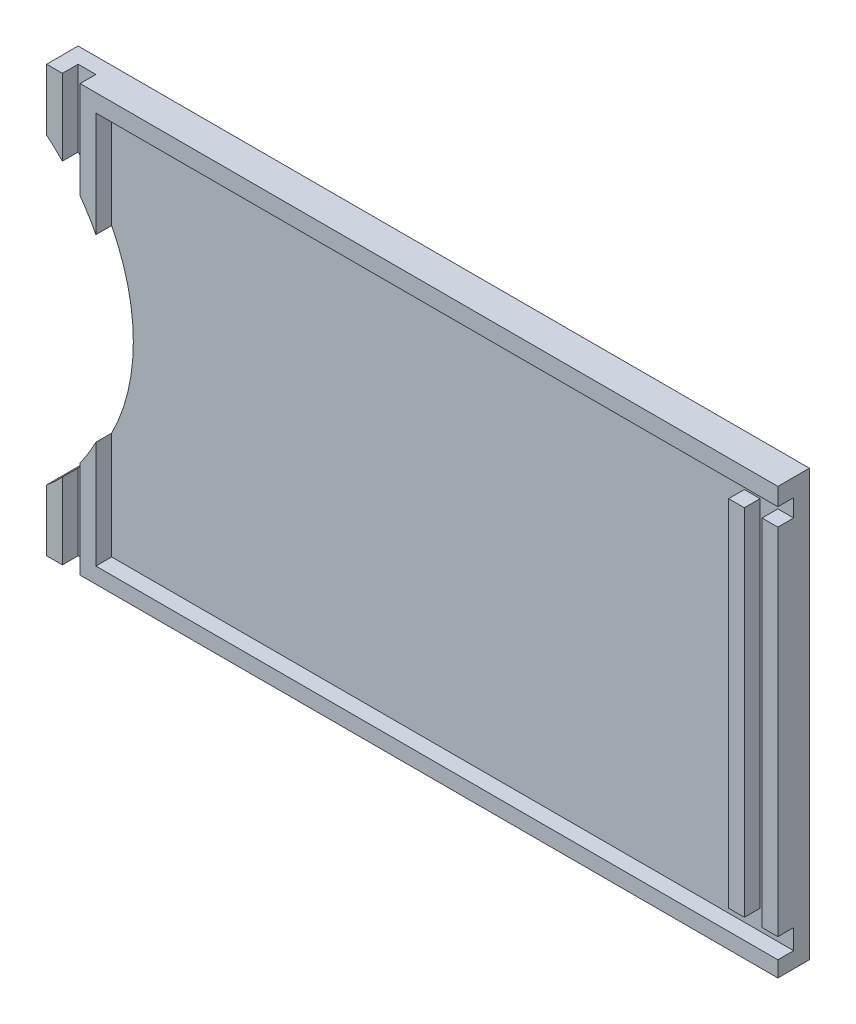
ISO-10303-21;
HEADER;
FILE_DESCRIPTION(('STEP AP214'),'2;1');
FILE_NAME('part.step','',(''),(''),'','','');
FILE_SCHEMA(('AUTOMOTIVE_DESIGN { 1 0 10303 214 1 1 1 1 }'));
ENDSEC;
DATA;
#1=APPLICATION_CONTEXT('core data for automotive mechanical design processes');
#2=APPLICATION_PROTOCOL_DEFINITION('international standard','automotive_design',2000,#1);
#3=PRODUCT_CONTEXT('',#1,'mechanical');
#4=PRODUCT('Part','Part','',(#3));
#5=PRODUCT_RELATED_PRODUCT_CATEGORY('part','',(#4));
#6=PRODUCT_DEFINITION_FORMATION('','',#4);
#7=PRODUCT_DEFINITION_CONTEXT('part definition',#1,'design');
#8=PRODUCT_DEFINITION('design','',#6,#7);
#9=PRODUCT_DEFINITION_SHAPE('','',#8);
#10=(LENGTH_UNIT() NAMED_UNIT(*) SI_UNIT(.MILLI.,.METRE.));
#11=(NAMED_UNIT(*) PLANE_ANGLE_UNIT() SI_UNIT($,.RADIAN.));
#12=(NAMED_UNIT(*) SI_UNIT($,.STERADIAN.) SOLID_ANGLE_UNIT());
#13=UNCERTAINTY_MEASURE_WITH_UNIT(LENGTH_MEASURE(1.E-05),#10,'distance_accuracy_value','');
#14=(GEOMETRIC_REPRESENTATION_CONTEXT(3) GLOBAL_UNCERTAINTY_ASSIGNED_CONTEXT((#13)) GLOBAL_UNIT_ASSIGNED_CONTEXT((#10,
#11,#12)) REPRESENTATION_CONTEXT('',''));
#15=CARTESIAN_POINT('',(0.,0.,0.));
#16=DIRECTION('',(0.,0.,1.));
#17=DIRECTION('',(1.,0.,0.));
#18=AXIS2_PLACEMENT_3D('',#15,#16,#17);
#19=CARTESIAN_POINT('',(118.091107297523,54.,-16.4879937354561));
#20=DIRECTION('',(0.,0.,-1.));
#21=DIRECTION('',(-1.,0.,0.));
#22=AXIS2_PLACEMENT_3D('',#19,#20,#21);
#23=PLANE('',#22);
#24=DIRECTION('',(-1.,0.,0.));
#25=VECTOR('',#24,1.);
#26=CARTESIAN_POINT('',(122.091107297523,-44.9153201748925,-16.4879937354561));
#27=LINE('',#26,#25);
#28=CARTESIAN_POINT('',(113.591107297523,-44.9153201748925,-16.4879937354561));
#29=VERTEX_POINT('',#28);
#30=CARTESIAN_POINT('',(109.591107297523,-44.9153201748925,-16.4879937354561));
#31=VERTEX_POINT('',#30);
#32=EDGE_CURVE('E383',#29,#31,#27,.T.);
#33=ORIENTED_EDGE('',*,*,#32,.T.);
#34=DIRECTION('',(0.,-1.,0.));
#35=VECTOR('',#34,1.);
#36=CARTESIAN_POINT('',(109.591107297523,54.,-16.4879937354561));
#37=LINE('',#36,#35);
#38=CARTESIAN_POINT('',(109.591107297523,45.0585432346725,-16.4879937354561));
#39=VERTEX_POINT('',#38);
#40=EDGE_CURVE('E342',#39,#31,#37,.T.);
#41=ORIENTED_EDGE('',*,*,#40,.F.);
#42=DIRECTION('',(1.,0.,0.));
#43=VECTOR('',#42,1.);
#44=CARTESIAN_POINT('',(122.091107297523,45.0585432346725,-16.4879937354561));
#45=LINE('',#44,#43);
#46=CARTESIAN_POINT('',(113.591107297523,45.0585432346725,-16.4879937354561));
#47=VERTEX_POINT('',#46);
#48=EDGE_CURVE('E408',#39,#47,#45,.T.);
#49=ORIENTED_EDGE('',*,*,#48,.T.);
#50=DIRECTION('',(0.,-1.,0.));
#51=VECTOR('',#50,1.);
#52=CARTESIAN_POINT('',(113.591107297523,54.,-16.4879937354561));
#53=LINE('',#52,#51);
#54=EDGE_CURVE('E334',#47,#29,#53,.T.);
#55=ORIENTED_EDGE('',*,*,#54,.T.);
#56=EDGE_LOOP('',(#33,#41,#49,#55));
#57=FACE_BOUND('',#56,.T.);
#58=DIRECTION('',(1.,0.,0.));
#59=VECTOR('',#58,1.);
#60=CARTESIAN_POINT('',(-50.9088927024772,49.5292716173362,-16.4879937354561));
#61=LINE('',#60,#59);
#62=CARTESIAN_POINT('',(-50.9088927024772,49.5292716173362,-16.4879937354561));
#63=VERTEX_POINT('',#62);
#64=CARTESIAN_POINT('',(122.091107297523,49.5292716173362,-16.4879937354561));
#65=VERTEX_POINT('',#64);
#66=EDGE_CURVE('E232',#63,#65,#61,.T.);
#67=ORIENTED_EDGE('',*,*,#66,.F.);
#68=DIRECTION('',(0.,-1.,0.));
#69=VECTOR('',#68,1.);
#70=CARTESIAN_POINT('',(-50.9088927024772,54.,-16.4879937354561));
#71=LINE('',#70,#69);
#72=CARTESIAN_POINT('',(-50.9088927024772,22.798026230356,-16.4879937354561));
#73=VERTEX_POINT('',#72);
#74=EDGE_CURVE('E240',#63,#73,#71,.T.);
#75=ORIENTED_EDGE('',*,*,#74,.T.);
#76=CARTESIAN_POINT('',(-95.4088927024772,0.,-16.4879937354561));
#77=DIRECTION('',(0.,0.,-1.));
#78=DIRECTION('',(-1.,0.,0.));
#79=AXIS2_PLACEMENT_3D('',#76,#77,#78);
#80=CIRCLE('',#79,50.);
#81=CARTESIAN_POINT('',(-50.9088927024772,-22.798026230356,-16.4879937354561));
#82=VERTEX_POINT('',#81);
#83=EDGE_CURVE('E352',#73,#82,#80,.T.);
#84=ORIENTED_EDGE('',*,*,#83,.T.);
#85=CARTESIAN_POINT('',(-50.9088927024772,-50.,-16.4879937354561));
#86=VERTEX_POINT('',#85);
#87=EDGE_CURVE('E344',#82,#86,#71,.T.);
#88=ORIENTED_EDGE('',*,*,#87,.T.);
#89=DIRECTION('',(-1.,0.,0.));
#90=VECTOR('',#89,1.);
#91=CARTESIAN_POINT('',(-50.9088927024772,-50.,-16.4879937354561));
#92=LINE('',#91,#90);
#93=CARTESIAN_POINT('',(122.091107297523,-50.,-16.4879937354561));
#94=VERTEX_POINT('',#93);
#95=EDGE_CURVE('E241',#94,#86,#92,.T.);
#96=ORIENTED_EDGE('',*,*,#95,.F.);
#97=DIRECTION('',(0.,1.,0.));
#98=VECTOR('',#97,1.);
#99=CARTESIAN_POINT('',(122.091107297523,-54.,-16.4879937354561));
#100=LINE('',#99,#98);
#101=CARTESIAN_POINT('',(122.091107297523,-44.9153201748925,-16.4879937354561));
#102=VERTEX_POINT('',#101);
#103=EDGE_CURVE('E387',#94,#102,#100,.T.);
#104=ORIENTED_EDGE('',*,*,#103,.T.);
#105=CARTESIAN_POINT('',(118.091107297523,-44.9153201748925,-16.4879937354561));
#106=VERTEX_POINT('',#105);
#107=EDGE_CURVE('E384',#102,#106,#27,.T.);
#108=ORIENTED_EDGE('',*,*,#107,.T.);
#109=DIRECTION('',(0.,-1.,0.));
#110=VECTOR('',#109,1.);
#111=CARTESIAN_POINT('',(118.091107297523,54.,-16.4879937354561));
#112=LINE('',#111,#110);
#113=CARTESIAN_POINT('',(118.091107297523,45.0585432346725,-16.4879937354561));
#114=VERTEX_POINT('',#113);
#115=EDGE_CURVE('E331',#114,#106,#112,.T.);
#116=ORIENTED_EDGE('',*,*,#115,.F.);
#117=CARTESIAN_POINT('',(122.091107297523,45.0585432346725,-16.4879937354561));
#118=VERTEX_POINT('',#117);
#119=EDGE_CURVE('E406',#114,#118,#45,.T.);
#120=ORIENTED_EDGE('',*,*,#119,.T.);
#121=DIRECTION('',(0.,1.,0.));
#122=VECTOR('',#121,1.);
#123=CARTESIAN_POINT('',(122.091107297523,54.,-16.4879937354561));
#124=LINE('',#123,#122);
#125=EDGE_CURVE('E402',#118,#65,#124,.T.);
#126=ORIENTED_EDGE('',*,*,#125,.T.);
#127=EDGE_LOOP('',(#67,#75,#84,#88,#96,#104,#108,#116,#120,#126));
#128=FACE_BOUND('',#127,.T.);
#129=ADVANCED_FACE('F35',(#57,#128),#23,.F.);
#130=CARTESIAN_POINT('',(-50.9088927024772,54.,-12.4879937354561));
#131=DIRECTION('',(-1.,0.,0.));
#132=DIRECTION('',(0.,0.,1.));
#133=AXIS2_PLACEMENT_3D('',#130,#131,#132);
#134=PLANE('',#133);
#135=DIRECTION('',(0.,0.,-1.));
#136=VECTOR('',#135,1.);
#137=CARTESIAN_POINT('',(-50.9088927024772,49.5292716173362,-12.4879937354561));
#138=LINE('',#137,#136);
#139=CARTESIAN_POINT('',(-50.9088927024772,49.5292716173362,-12.4879937354561));
#140=VERTEX_POINT('',#139);
#141=EDGE_CURVE('E223',#140,#63,#138,.T.);
#142=ORIENTED_EDGE('',*,*,#141,.F.);
#143=DIRECTION('',(0.,-1.,0.));
#144=VECTOR('',#143,1.);
#145=CARTESIAN_POINT('',(-50.9088927024772,54.,-12.4879937354561));
#146=LINE('',#145,#144);
#147=CARTESIAN_POINT('',(-50.9088927024772,22.798026230356,-12.4879937354561));
#148=VERTEX_POINT('',#147);
#149=EDGE_CURVE('E238',#140,#148,#146,.T.);
#150=ORIENTED_EDGE('',*,*,#149,.T.);
#151=DIRECTION('',(0.,0.,1.));
#152=VECTOR('',#151,1.);
#153=CARTESIAN_POINT('',(-50.9088927024772,22.798026230356,-22.4879937354561));
#154=LINE('',#153,#152);
#155=EDGE_CURVE('E356',#148,#73,#154,.F.);
#156=ORIENTED_EDGE('',*,*,#155,.T.);
#157=ORIENTED_EDGE('',*,*,#74,.F.);
#158=EDGE_LOOP('',(#142,#150,#156,#157));
#159=FACE_BOUND('',#158,.T.);
#160=ADVANCED_FACE('F236',(#159),#134,.F.);
#161=DIRECTION('',(0.,0.,-1.));
#162=VECTOR('',#161,1.);
#163=CARTESIAN_POINT('',(-50.9088927024772,-50.,-12.4879937354561));
#164=LINE('',#163,#162);
#165=CARTESIAN_POINT('',(-50.9088927024772,-50.,-12.4879937354561));
#166=VERTEX_POINT('',#165);
#167=EDGE_CURVE('E55',#166,#86,#164,.T.);
#168=ORIENTED_EDGE('',*,*,#167,.T.);
#169=ORIENTED_EDGE('',*,*,#87,.F.);
#170=DIRECTION('',(0.,0.,1.));
#171=VECTOR('',#170,1.);
#172=CARTESIAN_POINT('',(-50.9088927024772,-22.798026230356,-22.4879937354561));
#173=LINE('',#172,#171);
#174=CARTESIAN_POINT('',(-50.9088927024772,-22.798026230356,-12.4879937354561));
#175=VERTEX_POINT('',#174);
#176=EDGE_CURVE('E357',#82,#175,#173,.T.);
#177=ORIENTED_EDGE('',*,*,#176,.T.);
#178=EDGE_CURVE('E50',#175,#166,#146,.T.);
#179=ORIENTED_EDGE('',*,*,#178,.T.);
#180=EDGE_LOOP('',(#168,#169,#177,#179));
#181=FACE_BOUND('',#180,.T.);
#182=ADVANCED_FACE('F479',(#181),#134,.F.);
#183=CARTESIAN_POINT('',(-63.4088927024772,54.,-20.4879937354561));
#184=DIRECTION('',(1.,0.,0.));
#185=DIRECTION('',(0.,0.,-1.));
#186=AXIS2_PLACEMENT_3D('',#183,#184,#185);
#187=PLANE('',#186);
#188=DIRECTION('',(0.,-1.,0.));
#189=VECTOR('',#188,1.);
#190=CARTESIAN_POINT('',(-63.4088927024772,54.,-20.4879937354561));
#191=LINE('',#190,#189);
#192=CARTESIAN_POINT('',(-63.4088927024772,54.,-20.4879937354561));
#193=VERTEX_POINT('',#192);
#194=CARTESIAN_POINT('',(-63.4088927024772,38.4187454245971,-20.4879937354561));
#195=VERTEX_POINT('',#194);
#196=EDGE_CURVE('E319',#193,#195,#191,.T.);
#197=ORIENTED_EDGE('',*,*,#196,.T.);
#198=DIRECTION('',(0.,0.,1.));
#199=VECTOR('',#198,1.);
#200=CARTESIAN_POINT('',(-63.4088927024772,38.4187454245971,-22.4879937354561));
#201=LINE('',#200,#199);
#202=CARTESIAN_POINT('',(-63.4088927024772,38.4187454245971,-12.4879937354561));
#203=VERTEX_POINT('',#202);
#204=EDGE_CURVE('E358',#195,#203,#201,.T.);
#205=ORIENTED_EDGE('',*,*,#204,.T.);
#206=DIRECTION('',(0.,-1.,0.));
#207=VECTOR('',#206,1.);
#208=CARTESIAN_POINT('',(-63.4088927024772,54.,-12.4879937354561));
#209=LINE('',#208,#207);
#210=CARTESIAN_POINT('',(-63.4088927024772,54.,-12.4879937354561));
#211=VERTEX_POINT('',#210);
#212=EDGE_CURVE('E43',#211,#203,#209,.T.);
#213=ORIENTED_EDGE('',*,*,#212,.F.);
#214=DIRECTION('',(0.,0.,1.));
#215=VECTOR('',#214,1.);
#216=CARTESIAN_POINT('',(-63.4088927024772,54.,-20.4879937354561));
#217=LINE('',#216,#215);
#218=EDGE_CURVE('E318',#193,#211,#217,.T.);
#219=ORIENTED_EDGE('',*,*,#218,.F.);
#220=EDGE_LOOP('',(#197,#205,#213,#219));
#221=FACE_BOUND('',#220,.T.);
#222=ADVANCED_FACE('F438',(#221),#187,.F.);
#223=CARTESIAN_POINT('',(-63.4088927024772,54.,-12.4879937354561));
#224=DIRECTION('',(0.,0.,-1.));
#225=DIRECTION('',(-1.,0.,0.));
#226=AXIS2_PLACEMENT_3D('',#223,#224,#225);
#227=PLANE('',#226);
#228=ORIENTED_EDGE('',*,*,#212,.T.);
#229=CARTESIAN_POINT('',(-95.4088927024772,0.,-12.4879937354561));
#230=DIRECTION('',(0.,0.,1.));
#231=DIRECTION('',(1.,0.,0.));
#232=AXIS2_PLACEMENT_3D('',#229,#230,#231);
#233=CIRCLE('',#232,50.);
#234=CARTESIAN_POINT('',(-59.4088927024772,34.6987031457949,-12.4879937354561));
#235=VERTEX_POINT('',#234);
#236=EDGE_CURVE('E443',#235,#203,#233,.T.);
#237=ORIENTED_EDGE('',*,*,#236,.F.);
#238=DIRECTION('',(0.,-1.,0.));
#239=VECTOR('',#238,1.);
#240=CARTESIAN_POINT('',(-59.4088927024772,54.,-12.4879937354561));
#241=LINE('',#240,#239);
#242=CARTESIAN_POINT('',(-59.4088927024772,54.,-12.4879937354561));
#243=VERTEX_POINT('',#242);
#244=EDGE_CURVE('E263',#243,#235,#241,.T.);
#245=ORIENTED_EDGE('',*,*,#244,.F.);
#246=DIRECTION('',(1.,0.,0.));
#247=VECTOR('',#246,1.);
#248=CARTESIAN_POINT('',(-63.4088927024772,54.,-12.4879937354561));
#249=LINE('',#248,#247);
#250=EDGE_CURVE('E417',#211,#243,#249,.T.);
#251=ORIENTED_EDGE('',*,*,#250,.F.);
#252=EDGE_LOOP('',(#228,#237,#245,#251));
#253=FACE_BOUND('',#252,.T.);
#254=ADVANCED_FACE('F487',(#253),#227,.F.);
#255=CARTESIAN_POINT('',(-59.4088927024772,54.,-12.4879937354561));
#256=DIRECTION('',(-1.,0.,0.));
#257=DIRECTION('',(0.,0.,1.));
#258=AXIS2_PLACEMENT_3D('',#255,#256,#257);
#259=PLANE('',#258);
#260=DIRECTION('',(0.,-1.,0.));
#261=VECTOR('',#260,1.);
#262=CARTESIAN_POINT('',(-59.4088927024772,54.,-16.4879937354561));
#263=LINE('',#262,#261);
#264=CARTESIAN_POINT('',(-59.4088927024772,-34.698703145795,-16.4879937354561));
#265=VERTEX_POINT('',#264);
#266=CARTESIAN_POINT('',(-59.4088927024772,-54.,-16.4879937354561));
#267=VERTEX_POINT('',#266);
#268=EDGE_CURVE('E258',#265,#267,#263,.T.);
#269=ORIENTED_EDGE('',*,*,#268,.F.);
#270=DIRECTION('',(0.,0.,1.));
#271=VECTOR('',#270,1.);
#272=CARTESIAN_POINT('',(-59.4088927024772,-34.698703145795,-22.4879937354561));
#273=LINE('',#272,#271);
#274=CARTESIAN_POINT('',(-59.4088927024772,-34.698703145795,-12.4879937354561));
#275=VERTEX_POINT('',#274);
#276=EDGE_CURVE('E370',#265,#275,#273,.T.);
#277=ORIENTED_EDGE('',*,*,#276,.T.);
#278=CARTESIAN_POINT('',(-59.4088927024772,-54.,-12.4879937354561));
#279=VERTEX_POINT('',#278);
#280=EDGE_CURVE('E262',#275,#279,#241,.T.);
#281=ORIENTED_EDGE('',*,*,#280,.T.);
#282=DIRECTION('',(0.,0.,-1.));
#283=VECTOR('',#282,1.);
#284=CARTESIAN_POINT('',(-59.4088927024772,-54.,-12.4879937354561));
#285=LINE('',#284,#283);
#286=EDGE_CURVE('E291',#279,#267,#285,.T.);
#287=ORIENTED_EDGE('',*,*,#286,.T.);
#288=EDGE_LOOP('',(#269,#277,#281,#287));
#289=FACE_BOUND('',#288,.T.);
#290=ADVANCED_FACE('F478',(#289),#259,.F.);
#291=CARTESIAN_POINT('',(-59.4088927024772,54.,-16.4879937354561));
#292=DIRECTION('',(0.,0.,-1.));
#293=DIRECTION('',(-1.,0.,0.));
#294=AXIS2_PLACEMENT_3D('',#291,#292,#293);
#295=PLANE('',#294);
#296=CARTESIAN_POINT('',(-59.4088927024772,54.,-16.4879937354561));
#297=VERTEX_POINT('',#296);
#298=CARTESIAN_POINT('',(-59.4088927024772,34.6987031457949,-16.4879937354561));
#299=VERTEX_POINT('',#298);
#300=EDGE_CURVE('E259',#297,#299,#263,.T.);
#301=ORIENTED_EDGE('',*,*,#300,.T.);
#302=CARTESIAN_POINT('',(-95.4088927024772,0.,-16.4879937354561));
#303=DIRECTION('',(0.,0.,-1.));
#304=DIRECTION('',(-1.,0.,0.));
#305=AXIS2_PLACEMENT_3D('',#302,#303,#304);
#306=CIRCLE('',#305,50.);
#307=CARTESIAN_POINT('',(-54.9088927024772,29.3214938227915,-16.4879937354561));
#308=VERTEX_POINT('',#307);
#309=EDGE_CURVE('E371',#299,#308,#306,.T.);
#310=ORIENTED_EDGE('',*,*,#309,.T.);
#311=DIRECTION('',(0.,-1.,0.));
#312=VECTOR('',#311,1.);
#313=CARTESIAN_POINT('',(-54.9088927024772,54.,-16.4879937354561));
#314=LINE('',#313,#312);
#315=CARTESIAN_POINT('',(-54.9088927024772,54.,-16.4879937354561));
#316=VERTEX_POINT('',#315);
#317=EDGE_CURVE('E255',#316,#308,#314,.T.);
#318=ORIENTED_EDGE('',*,*,#317,.F.);
#319=DIRECTION('',(1.,0.,0.));
#320=VECTOR('',#319,1.);
#321=CARTESIAN_POINT('',(-59.4088927024772,54.,-16.4879937354561));
#322=LINE('',#321,#320);
#323=EDGE_CURVE('E421',#297,#316,#322,.T.);
#324=ORIENTED_EDGE('',*,*,#323,.F.);
#325=EDGE_LOOP('',(#301,#310,#318,#324));
#326=FACE_BOUND('',#325,.T.);
#327=ADVANCED_FACE('F523',(#326),#295,.F.);
#328=CARTESIAN_POINT('',(-54.9088927024772,54.,-16.4879937354561));
#329=DIRECTION('',(1.,0.,0.));
#330=DIRECTION('',(0.,0.,-1.));
#331=AXIS2_PLACEMENT_3D('',#328,#329,#330);
#332=PLANE('',#331);
#333=ORIENTED_EDGE('',*,*,#317,.T.);
#334=DIRECTION('',(0.,0.,1.));
#335=VECTOR('',#334,1.);
#336=CARTESIAN_POINT('',(-54.9088927024772,29.3214938227915,-22.4879937354561));
#337=LINE('',#336,#335);
#338=CARTESIAN_POINT('',(-54.9088927024772,29.3214938227915,-12.4879937354561));
#339=VERTEX_POINT('',#338);
#340=EDGE_CURVE('E374',#308,#339,#337,.T.);
#341=ORIENTED_EDGE('',*,*,#340,.T.);
#342=DIRECTION('',(0.,-1.,0.));
#343=VECTOR('',#342,1.);
#344=CARTESIAN_POINT('',(-54.9088927024772,54.,-12.4879937354561));
#345=LINE('',#344,#343);
#346=CARTESIAN_POINT('',(-54.9088927024772,54.,-12.4879937354561));
#347=VERTEX_POINT('',#346);
#348=EDGE_CURVE('E249',#347,#339,#345,.T.);
#349=ORIENTED_EDGE('',*,*,#348,.F.);
#350=DIRECTION('',(0.,0.,1.));
#351=VECTOR('',#350,1.);
#352=CARTESIAN_POINT('',(-54.9088927024772,54.,-16.4879937354561));
#353=LINE('',#352,#351);
#354=EDGE_CURVE('E423',#316,#347,#353,.T.);
#355=ORIENTED_EDGE('',*,*,#354,.F.);
#356=EDGE_LOOP('',(#333,#341,#349,#355));
#357=FACE_BOUND('',#356,.T.);
#358=ADVANCED_FACE('F519',(#357),#332,.F.);
#359=CARTESIAN_POINT('',(-54.9088927024772,54.,-12.4879937354561));
#360=DIRECTION('',(0.,0.,-1.));
#361=DIRECTION('',(-1.,0.,0.));
#362=AXIS2_PLACEMENT_3D('',#359,#360,#361);
#363=PLANE('',#362);
#364=ORIENTED_EDGE('',*,*,#348,.T.);
#365=EDGE_CURVE('E246',#148,#339,#233,.T.);
#366=ORIENTED_EDGE('',*,*,#365,.F.);
#367=ORIENTED_EDGE('',*,*,#149,.F.);
#368=DIRECTION('',(1.,0.,0.));
#369=VECTOR('',#368,1.);
#370=CARTESIAN_POINT('',(-50.9088927024772,49.5292716173362,-12.4879937354561));
#371=LINE('',#370,#369);
#372=CARTESIAN_POINT('',(122.091107297523,49.5292716173362,-12.4879937354561));
#373=VERTEX_POINT('',#372);
#374=EDGE_CURVE('E220',#140,#373,#371,.T.);
#375=ORIENTED_EDGE('',*,*,#374,.T.);
#376=DIRECTION('',(0.,1.,0.));
#377=VECTOR('',#376,1.);
#378=CARTESIAN_POINT('',(122.091107297523,54.,-12.4879937354561));
#379=LINE('',#378,#377);
#380=CARTESIAN_POINT('',(122.091107297523,54.,-12.4879937354561));
#381=VERTEX_POINT('',#380);
#382=EDGE_CURVE('E231',#373,#381,#379,.T.);
#383=ORIENTED_EDGE('',*,*,#382,.T.);
#384=DIRECTION('',(1.,0.,0.));
#385=VECTOR('',#384,1.);
#386=CARTESIAN_POINT('',(-54.9088927024772,54.,-12.4879937354561));
#387=LINE('',#386,#385);
#388=EDGE_CURVE('E425',#347,#381,#387,.T.);
#389=ORIENTED_EDGE('',*,*,#388,.F.);
#390=EDGE_LOOP('',(#364,#366,#367,#375,#383,#389));
#391=FACE_BOUND('',#390,.T.);
#392=ADVANCED_FACE('F245',(#391),#363,.F.);
#393=CARTESIAN_POINT('',(-63.4088927024772,-38.4187454245971,-12.4879937354561));
#394=VERTEX_POINT('',#393);
#395=CARTESIAN_POINT('',(-63.4088927024772,-54.,-12.4879937354561));
#396=VERTEX_POINT('',#395);
#397=EDGE_CURVE('E265',#394,#396,#209,.T.);
#398=ORIENTED_EDGE('',*,*,#397,.F.);
#399=DIRECTION('',(0.,0.,1.));
#400=VECTOR('',#399,1.);
#401=CARTESIAN_POINT('',(-63.4088927024772,-38.4187454245971,-22.4879937354561));
#402=LINE('',#401,#400);
#403=CARTESIAN_POINT('',(-63.4088927024772,-38.4187454245971,-20.4879937354561));
#404=VERTEX_POINT('',#403);
#405=EDGE_CURVE('E439',#394,#404,#402,.F.);
#406=ORIENTED_EDGE('',*,*,#405,.T.);
#407=CARTESIAN_POINT('',(-63.4088927024772,-54.,-20.4879937354561));
#408=VERTEX_POINT('',#407);
#409=EDGE_CURVE('E294',#404,#408,#191,.T.);
#410=ORIENTED_EDGE('',*,*,#409,.T.);
#411=DIRECTION('',(0.,0.,1.));
#412=VECTOR('',#411,1.);
#413=CARTESIAN_POINT('',(-63.4088927024772,-54.,-20.4879937354561));
#414=LINE('',#413,#412);
#415=EDGE_CURVE('E288',#408,#396,#414,.T.);
#416=ORIENTED_EDGE('',*,*,#415,.T.);
#417=EDGE_LOOP('',(#398,#406,#410,#416));
#418=FACE_BOUND('',#417,.T.);
#419=ADVANCED_FACE('F37',(#418),#187,.F.);
#420=ORIENTED_EDGE('',*,*,#280,.F.);
#421=EDGE_CURVE('E279',#394,#275,#233,.T.);
#422=ORIENTED_EDGE('',*,*,#421,.F.);
#423=ORIENTED_EDGE('',*,*,#397,.T.);
#424=DIRECTION('',(1.,0.,0.));
#425=VECTOR('',#424,1.);
#426=CARTESIAN_POINT('',(-63.4088927024772,-54.,-12.4879937354561));
#427=LINE('',#426,#425);
#428=EDGE_CURVE('E277',#396,#279,#427,.T.);
#429=ORIENTED_EDGE('',*,*,#428,.T.);
#430=EDGE_LOOP('',(#420,#422,#423,#429));
#431=FACE_BOUND('',#430,.T.);
#432=ADVANCED_FACE('F276',(#431),#227,.F.);
#433=ORIENTED_EDGE('',*,*,#244,.T.);
#434=DIRECTION('',(0.,0.,1.));
#435=VECTOR('',#434,1.);
#436=CARTESIAN_POINT('',(-59.4088927024772,34.6987031457949,-22.4879937354561));
#437=LINE('',#436,#435);
#438=EDGE_CURVE('E377',#235,#299,#437,.F.);
#439=ORIENTED_EDGE('',*,*,#438,.T.);
#440=ORIENTED_EDGE('',*,*,#300,.F.);
#441=DIRECTION('',(0.,0.,-1.));
#442=VECTOR('',#441,1.);
#443=CARTESIAN_POINT('',(-59.4088927024772,54.,-12.4879937354561));
#444=LINE('',#443,#442);
#445=EDGE_CURVE('E419',#243,#297,#444,.T.);
#446=ORIENTED_EDGE('',*,*,#445,.F.);
#447=EDGE_LOOP('',(#433,#439,#440,#446));
#448=FACE_BOUND('',#447,.T.);
#449=ADVANCED_FACE('F532',(#448),#259,.F.);
#450=CARTESIAN_POINT('',(-54.9088927024772,-29.3214938227915,-16.4879937354561));
#451=VERTEX_POINT('',#450);
#452=CARTESIAN_POINT('',(-54.9088927024772,-54.,-16.4879937354561));
#453=VERTEX_POINT('',#452);
#454=EDGE_CURVE('E254',#451,#453,#314,.T.);
#455=ORIENTED_EDGE('',*,*,#454,.F.);
#456=EDGE_CURVE('E367',#451,#265,#306,.T.);
#457=ORIENTED_EDGE('',*,*,#456,.T.);
#458=ORIENTED_EDGE('',*,*,#268,.T.);
#459=DIRECTION('',(1.,0.,0.));
#460=VECTOR('',#459,1.);
#461=CARTESIAN_POINT('',(-59.4088927024772,-54.,-16.4879937354561));
#462=LINE('',#461,#460);
#463=EDGE_CURVE('E306',#267,#453,#462,.T.);
#464=ORIENTED_EDGE('',*,*,#463,.T.);
#465=EDGE_LOOP('',(#455,#457,#458,#464));
#466=FACE_BOUND('',#465,.T.);
#467=ADVANCED_FACE('F475',(#466),#295,.F.);
#468=CARTESIAN_POINT('',(-54.9088927024772,-29.3214938227915,-12.4879937354561));
#469=VERTEX_POINT('',#468);
#470=CARTESIAN_POINT('',(-54.9088927024772,-54.,-12.4879937354561));
#471=VERTEX_POINT('',#470);
#472=EDGE_CURVE('E247',#469,#471,#345,.T.);
#473=ORIENTED_EDGE('',*,*,#472,.F.);
#474=DIRECTION('',(0.,0.,1.));
#475=VECTOR('',#474,1.);
#476=CARTESIAN_POINT('',(-54.9088927024772,-29.3214938227915,-22.4879937354561));
#477=LINE('',#476,#475);
#478=EDGE_CURVE('E361',#469,#451,#477,.F.);
#479=ORIENTED_EDGE('',*,*,#478,.T.);
#480=ORIENTED_EDGE('',*,*,#454,.T.);
#481=DIRECTION('',(0.,0.,1.));
#482=VECTOR('',#481,1.);
#483=CARTESIAN_POINT('',(-54.9088927024772,-54.,-16.4879937354561));
#484=LINE('',#483,#482);
#485=EDGE_CURVE('E309',#453,#471,#484,.T.);
#486=ORIENTED_EDGE('',*,*,#485,.T.);
#487=EDGE_LOOP('',(#473,#479,#480,#486));
#488=FACE_BOUND('',#487,.T.);
#489=ADVANCED_FACE('F472',(#488),#332,.F.);
#490=ORIENTED_EDGE('',*,*,#178,.F.);
#491=EDGE_CURVE('E444',#469,#175,#233,.T.);
#492=ORIENTED_EDGE('',*,*,#491,.F.);
#493=ORIENTED_EDGE('',*,*,#472,.T.);
#494=DIRECTION('',(1.,0.,0.));
#495=VECTOR('',#494,1.);
#496=CARTESIAN_POINT('',(-54.9088927024772,-54.,-12.4879937354561));
#497=LINE('',#496,#495);
#498=CARTESIAN_POINT('',(122.091107297523,-54.,-12.4879937354561));
#499=VERTEX_POINT('',#498);
#500=EDGE_CURVE('E312',#471,#499,#497,.T.);
#501=ORIENTED_EDGE('',*,*,#500,.T.);
#502=DIRECTION('',(0.,1.,0.));
#503=VECTOR('',#502,1.);
#504=CARTESIAN_POINT('',(122.091107297523,-54.,-12.4879937354561));
#505=LINE('',#504,#503);
#506=CARTESIAN_POINT('',(122.091107297523,-50.,-12.4879937354561));
#507=VERTEX_POINT('',#506);
#508=EDGE_CURVE('E451',#499,#507,#505,.T.);
#509=ORIENTED_EDGE('',*,*,#508,.T.);
#510=DIRECTION('',(-1.,0.,0.));
#511=VECTOR('',#510,1.);
#512=CARTESIAN_POINT('',(-50.9088927024772,-50.,-12.4879937354561));
#513=LINE('',#512,#511);
#514=EDGE_CURVE('E449',#507,#166,#513,.T.);
#515=ORIENTED_EDGE('',*,*,#514,.T.);
#516=EDGE_LOOP('',(#490,#492,#493,#501,#509,#515));
#517=FACE_BOUND('',#516,.T.);
#518=ADVANCED_FACE('F468',(#517),#363,.F.);
#519=CARTESIAN_POINT('',(109.591107297523,54.,-12.4879937354561));
#520=DIRECTION('',(1.,0.,0.));
#521=DIRECTION('',(0.,0.,-1.));
#522=AXIS2_PLACEMENT_3D('',#519,#520,#521);
#523=PLANE('',#522);
#524=ORIENTED_EDGE('',*,*,#40,.T.);
#525=DIRECTION('',(0.,0.,1.));
#526=VECTOR('',#525,1.);
#527=CARTESIAN_POINT('',(109.591107297523,-44.9153201748925,-12.4879937354561));
#528=LINE('',#527,#526);
#529=CARTESIAN_POINT('',(109.591107297523,-44.9153201748925,-12.4879937354561));
#530=VERTEX_POINT('',#529);
#531=EDGE_CURVE('E397',#31,#530,#528,.T.);
#532=ORIENTED_EDGE('',*,*,#531,.T.);
#533=DIRECTION('',(0.,-1.,0.));
#534=VECTOR('',#533,1.);
#535=CARTESIAN_POINT('',(109.591107297523,54.,-12.4879937354561));
#536=LINE('',#535,#534);
#537=CARTESIAN_POINT('',(109.591107297523,45.0585432346725,-12.4879937354561));
#538=VERTEX_POINT('',#537);
#539=EDGE_CURVE('E340',#538,#530,#536,.T.);
#540=ORIENTED_EDGE('',*,*,#539,.F.);
#541=DIRECTION('',(0.,0.,-1.));
#542=VECTOR('',#541,1.);
#543=CARTESIAN_POINT('',(109.591107297523,45.0585432346725,-12.4879937354561));
#544=LINE('',#543,#542);
#545=EDGE_CURVE('E296',#538,#39,#544,.T.);
#546=ORIENTED_EDGE('',*,*,#545,.T.);
#547=EDGE_LOOP('',(#524,#532,#540,#546));
#548=FACE_BOUND('',#547,.T.);
#549=ADVANCED_FACE('F507',(#548),#523,.F.);
#550=CARTESIAN_POINT('',(113.591107297523,54.,-12.4879937354561));
#551=DIRECTION('',(0.,0.,-1.));
#552=DIRECTION('',(-1.,0.,0.));
#553=AXIS2_PLACEMENT_3D('',#550,#551,#552);
#554=PLANE('',#553);
#555=ORIENTED_EDGE('',*,*,#539,.T.);
#556=DIRECTION('',(-1.,0.,0.));
#557=VECTOR('',#556,1.);
#558=CARTESIAN_POINT('',(122.091107297523,-44.9153201748925,-12.4879937354561));
#559=LINE('',#558,#557);
#560=CARTESIAN_POINT('',(113.591107297523,-44.9153201748925,-12.4879937354561));
#561=VERTEX_POINT('',#560);
#562=EDGE_CURVE('E380',#561,#530,#559,.T.);
#563=ORIENTED_EDGE('',*,*,#562,.F.);
#564=DIRECTION('',(0.,-1.,0.));
#565=VECTOR('',#564,1.);
#566=CARTESIAN_POINT('',(113.591107297523,54.,-12.4879937354561));
#567=LINE('',#566,#565);
#568=CARTESIAN_POINT('',(113.591107297523,45.0585432346725,-12.4879937354561));
#569=VERTEX_POINT('',#568);
#570=EDGE_CURVE('E337',#569,#561,#567,.T.);
#571=ORIENTED_EDGE('',*,*,#570,.F.);
#572=DIRECTION('',(1.,0.,0.));
#573=VECTOR('',#572,1.);
#574=CARTESIAN_POINT('',(122.091107297523,45.0585432346725,-12.4879937354561));
#575=LINE('',#574,#573);
#576=EDGE_CURVE('E401',#538,#569,#575,.T.);
#577=ORIENTED_EDGE('',*,*,#576,.F.);
#578=EDGE_LOOP('',(#555,#563,#571,#577));
#579=FACE_BOUND('',#578,.T.);
#580=ADVANCED_FACE('F504',(#579),#554,.F.);
#581=CARTESIAN_POINT('',(113.591107297523,54.,-16.4879937354561));
#582=DIRECTION('',(-1.,0.,0.));
#583=DIRECTION('',(0.,0.,1.));
#584=AXIS2_PLACEMENT_3D('',#581,#582,#583);
#585=PLANE('',#584);
#586=ORIENTED_EDGE('',*,*,#570,.T.);
#587=DIRECTION('',(0.,0.,-1.));
#588=VECTOR('',#587,1.);
#589=CARTESIAN_POINT('',(113.591107297523,-44.9153201748925,-16.4879937354561));
#590=LINE('',#589,#588);
#591=EDGE_CURVE('E394',#561,#29,#590,.T.);
#592=ORIENTED_EDGE('',*,*,#591,.T.);
#593=ORIENTED_EDGE('',*,*,#54,.F.);
#594=DIRECTION('',(0.,0.,1.));
#595=VECTOR('',#594,1.);
#596=CARTESIAN_POINT('',(113.591107297523,45.0585432346725,-16.4879937354561));
#597=LINE('',#596,#595);
#598=EDGE_CURVE('E299',#47,#569,#597,.T.);
#599=ORIENTED_EDGE('',*,*,#598,.T.);
#600=EDGE_LOOP('',(#586,#592,#593,#599));
#601=FACE_BOUND('',#600,.T.);
#602=ADVANCED_FACE('F501',(#601),#585,.F.);
#603=CARTESIAN_POINT('',(118.091107297523,54.,-12.4879937354561));
#604=DIRECTION('',(1.,0.,0.));
#605=DIRECTION('',(0.,0.,-1.));
#606=AXIS2_PLACEMENT_3D('',#603,#604,#605);
#607=PLANE('',#606);
#608=ORIENTED_EDGE('',*,*,#115,.T.);
#609=DIRECTION('',(0.,0.,1.));
#610=VECTOR('',#609,1.);
#611=CARTESIAN_POINT('',(118.091107297523,-44.9153201748925,-12.4879937354561));
#612=LINE('',#611,#610);
#613=CARTESIAN_POINT('',(118.091107297523,-44.9153201748925,-12.4879937354561));
#614=VERTEX_POINT('',#613);
#615=EDGE_CURVE('E391',#106,#614,#612,.T.);
#616=ORIENTED_EDGE('',*,*,#615,.T.);
#617=DIRECTION('',(0.,-1.,0.));
#618=VECTOR('',#617,1.);
#619=CARTESIAN_POINT('',(118.091107297523,54.,-12.4879937354561));
#620=LINE('',#619,#618);
#621=CARTESIAN_POINT('',(118.091107297523,45.0585432346725,-12.4879937354561));
#622=VERTEX_POINT('',#621);
#623=EDGE_CURVE('E328',#622,#614,#620,.T.);
#624=ORIENTED_EDGE('',*,*,#623,.F.);
#625=DIRECTION('',(0.,0.,-1.));
#626=VECTOR('',#625,1.);
#627=CARTESIAN_POINT('',(118.091107297523,45.0585432346725,-12.4879937354561));
#628=LINE('',#627,#626);
#629=EDGE_CURVE('E404',#622,#114,#628,.T.);
#630=ORIENTED_EDGE('',*,*,#629,.T.);
#631=EDGE_LOOP('',(#608,#616,#624,#630));
#632=FACE_BOUND('',#631,.T.);
#633=ADVANCED_FACE('F499',(#632),#607,.F.);
#634=CARTESIAN_POINT('',(122.091107297523,54.,-12.4879937354561));
#635=DIRECTION('',(0.,0.,-1.));
#636=DIRECTION('',(-1.,0.,0.));
#637=AXIS2_PLACEMENT_3D('',#634,#635,#636);
#638=PLANE('',#637);
#639=ORIENTED_EDGE('',*,*,#623,.T.);
#640=CARTESIAN_POINT('',(122.091107297523,-44.9153201748925,-12.4879937354561));
#641=VERTEX_POINT('',#640);
#642=EDGE_CURVE('E381',#641,#614,#559,.T.);
#643=ORIENTED_EDGE('',*,*,#642,.F.);
#644=DIRECTION('',(0.,-1.,0.));
#645=VECTOR('',#644,1.);
#646=CARTESIAN_POINT('',(122.091107297523,54.,-12.4879937354561));
#647=LINE('',#646,#645);
#648=CARTESIAN_POINT('',(122.091107297523,45.0585432346725,-12.4879937354561));
#649=VERTEX_POINT('',#648);
#650=EDGE_CURVE('E325',#649,#641,#647,.T.);
#651=ORIENTED_EDGE('',*,*,#650,.F.);
#652=EDGE_CURVE('E399',#622,#649,#575,.T.);
#653=ORIENTED_EDGE('',*,*,#652,.F.);
#654=EDGE_LOOP('',(#639,#643,#651,#653));
#655=FACE_BOUND('',#654,.T.);
#656=ADVANCED_FACE('F649',(#655),#638,.F.);
#657=CARTESIAN_POINT('',(122.091107297523,54.,-20.4879937354561));
#658=DIRECTION('',(-1.,0.,0.));
#659=DIRECTION('',(0.,0.,1.));
#660=AXIS2_PLACEMENT_3D('',#657,#658,#659);
#661=PLANE('',#660);
#662=DIRECTION('',(0.,0.,1.));
#663=VECTOR('',#662,1.);
#664=CARTESIAN_POINT('',(122.091107297523,-44.9153201748925,-31.9699107597812));
#665=LINE('',#664,#663);
#666=EDGE_CURVE('E389',#102,#641,#665,.T.);
#667=ORIENTED_EDGE('',*,*,#666,.F.);
#668=ORIENTED_EDGE('',*,*,#103,.F.);
#669=DIRECTION('',(0.,0.,-1.));
#670=VECTOR('',#669,1.);
#671=CARTESIAN_POINT('',(122.091107297523,-50.,-12.4879937354561));
#672=LINE('',#671,#670);
#673=EDGE_CURVE('E445',#507,#94,#672,.T.);
#674=ORIENTED_EDGE('',*,*,#673,.F.);
#675=ORIENTED_EDGE('',*,*,#508,.F.);
#676=DIRECTION('',(0.,0.,-1.));
#677=VECTOR('',#676,1.);
#678=CARTESIAN_POINT('',(122.091107297523,-54.,-20.4879937354561));
#679=LINE('',#678,#677);
#680=CARTESIAN_POINT('',(122.091107297523,-54.,-20.4879937354561));
#681=VERTEX_POINT('',#680);
#682=EDGE_CURVE('E314',#499,#681,#679,.T.);
#683=ORIENTED_EDGE('',*,*,#682,.T.);
#684=DIRECTION('',(0.,-1.,0.));
#685=VECTOR('',#684,1.);
#686=CARTESIAN_POINT('',(122.091107297523,54.,-20.4879937354561));
#687=LINE('',#686,#685);
#688=CARTESIAN_POINT('',(122.091107297523,54.,-20.4879937354561));
#689=VERTEX_POINT('',#688);
#690=EDGE_CURVE('E322',#689,#681,#687,.T.);
#691=ORIENTED_EDGE('',*,*,#690,.F.);
#692=DIRECTION('',(0.,0.,-1.));
#693=VECTOR('',#692,1.);
#694=CARTESIAN_POINT('',(122.091107297523,54.,-20.4879937354561));
#695=LINE('',#694,#693);
#696=EDGE_CURVE('E426',#381,#689,#695,.T.);
#697=ORIENTED_EDGE('',*,*,#696,.F.);
#698=ORIENTED_EDGE('',*,*,#382,.F.);
#699=DIRECTION('',(0.,0.,-1.));
#700=VECTOR('',#699,1.);
#701=CARTESIAN_POINT('',(122.091107297523,49.5292716173362,-12.4879937354561));
#702=LINE('',#701,#700);
#703=EDGE_CURVE('E226',#373,#65,#702,.T.);
#704=ORIENTED_EDGE('',*,*,#703,.T.);
#705=ORIENTED_EDGE('',*,*,#125,.F.);
#706=DIRECTION('',(0.,0.,1.));
#707=VECTOR('',#706,1.);
#708=CARTESIAN_POINT('',(122.091107297523,45.0585432346725,-31.8913408406391));
#709=LINE('',#708,#707);
#710=EDGE_CURVE('E405',#118,#649,#709,.T.);
#711=ORIENTED_EDGE('',*,*,#710,.T.);
#712=ORIENTED_EDGE('',*,*,#650,.T.);
#713=EDGE_LOOP('',(#667,#668,#674,#675,#683,#691,#697,#698,#704,#705,#711,#712));
#714=FACE_BOUND('',#713,.T.);
#715=ADVANCED_FACE('F459',(#714),#661,.F.);
#716=CARTESIAN_POINT('',(-63.4088927024772,54.,-20.4879937354561));
#717=DIRECTION('',(0.,0.,1.));
#718=DIRECTION('',(1.,0.,0.));
#719=AXIS2_PLACEMENT_3D('',#716,#717,#718);
#720=PLANE('',#719);
#721=ORIENTED_EDGE('',*,*,#409,.F.);
#722=CARTESIAN_POINT('',(-95.4088927024772,0.,-20.4879937354561));
#723=DIRECTION('',(0.,0.,1.));
#724=DIRECTION('',(1.,0.,0.));
#725=AXIS2_PLACEMENT_3D('',#722,#723,#724);
#726=CIRCLE('',#725,50.);
#727=EDGE_CURVE('E11',#404,#195,#726,.T.);
#728=ORIENTED_EDGE('',*,*,#727,.T.);
#729=ORIENTED_EDGE('',*,*,#196,.F.);
#730=DIRECTION('',(-1.,0.,0.));
#731=VECTOR('',#730,1.);
#732=CARTESIAN_POINT('',(-63.4088927024772,54.,-20.4879937354561));
#733=LINE('',#732,#731);
#734=EDGE_CURVE('E302',#689,#193,#733,.T.);
#735=ORIENTED_EDGE('',*,*,#734,.F.);
#736=ORIENTED_EDGE('',*,*,#690,.T.);
#737=DIRECTION('',(-1.,0.,0.));
#738=VECTOR('',#737,1.);
#739=CARTESIAN_POINT('',(-63.4088927024772,-54.,-20.4879937354561));
#740=LINE('',#739,#738);
#741=EDGE_CURVE('E316',#681,#408,#740,.T.);
#742=ORIENTED_EDGE('',*,*,#741,.T.);
#743=EDGE_LOOP('',(#721,#728,#729,#735,#736,#742));
#744=FACE_BOUND('',#743,.T.);
#745=ADVANCED_FACE('F435',(#744),#720,.F.);
#746=CARTESIAN_POINT('',(0.,54.,0.));
#747=DIRECTION('',(0.,1.,0.));
#748=DIRECTION('',(0.,0.,1.));
#749=AXIS2_PLACEMENT_3D('',#746,#747,#748);
#750=PLANE('',#749);
#751=ORIENTED_EDGE('',*,*,#388,.T.);
#752=ORIENTED_EDGE('',*,*,#696,.T.);
#753=ORIENTED_EDGE('',*,*,#734,.T.);
#754=ORIENTED_EDGE('',*,*,#218,.T.);
#755=ORIENTED_EDGE('',*,*,#250,.T.);
#756=ORIENTED_EDGE('',*,*,#445,.T.);
#757=ORIENTED_EDGE('',*,*,#323,.T.);
#758=ORIENTED_EDGE('',*,*,#354,.T.);
#759=EDGE_LOOP('',(#751,#752,#753,#754,#755,#756,#757,#758));
#760=FACE_BOUND('',#759,.T.);
#761=ADVANCED_FACE('F432',(#760),#750,.T.);
#762=CARTESIAN_POINT('',(0.,-54.,0.));
#763=DIRECTION('',(0.,1.,0.));
#764=DIRECTION('',(0.,0.,1.));
#765=AXIS2_PLACEMENT_3D('',#762,#763,#764);
#766=PLANE('',#765);
#767=ORIENTED_EDGE('',*,*,#682,.F.);
#768=ORIENTED_EDGE('',*,*,#500,.F.);
#769=ORIENTED_EDGE('',*,*,#485,.F.);
#770=ORIENTED_EDGE('',*,*,#463,.F.);
#771=ORIENTED_EDGE('',*,*,#286,.F.);
#772=ORIENTED_EDGE('',*,*,#428,.F.);
#773=ORIENTED_EDGE('',*,*,#415,.F.);
#774=ORIENTED_EDGE('',*,*,#741,.F.);
#775=EDGE_LOOP('',(#767,#768,#769,#770,#771,#772,#773,#774));
#776=FACE_BOUND('',#775,.T.);
#777=ADVANCED_FACE('F286',(#776),#766,.F.);
#778=CARTESIAN_POINT('',(122.091107297523,45.0585432346725,-31.8913408406391));
#779=DIRECTION('',(0.,-1.,0.));
#780=DIRECTION('',(0.,0.,-1.));
#781=AXIS2_PLACEMENT_3D('',#778,#779,#780);
#782=PLANE('',#781);
#783=ORIENTED_EDGE('',*,*,#576,.T.);
#784=ORIENTED_EDGE('',*,*,#598,.F.);
#785=ORIENTED_EDGE('',*,*,#48,.F.);
#786=ORIENTED_EDGE('',*,*,#545,.F.);
#787=EDGE_LOOP('',(#783,#784,#785,#786));
#788=FACE_BOUND('',#787,.T.);
#789=ADVANCED_FACE('F673',(#788),#782,.F.);
#790=ORIENTED_EDGE('',*,*,#652,.T.);
#791=ORIENTED_EDGE('',*,*,#710,.F.);
#792=ORIENTED_EDGE('',*,*,#119,.F.);
#793=ORIENTED_EDGE('',*,*,#629,.F.);
#794=EDGE_LOOP('',(#790,#791,#792,#793));
#795=FACE_BOUND('',#794,.T.);
#796=ADVANCED_FACE('F701',(#795),#782,.F.);
#797=CARTESIAN_POINT('',(122.091107297523,-44.9153201748925,-31.9699107597812));
#798=DIRECTION('',(0.,1.,0.));
#799=DIRECTION('',(0.,0.,1.));
#800=AXIS2_PLACEMENT_3D('',#797,#798,#799);
#801=PLANE('',#800);
#802=ORIENTED_EDGE('',*,*,#32,.F.);
#803=ORIENTED_EDGE('',*,*,#591,.F.);
#804=ORIENTED_EDGE('',*,*,#562,.T.);
#805=ORIENTED_EDGE('',*,*,#531,.F.);
#806=EDGE_LOOP('',(#802,#803,#804,#805));
#807=FACE_BOUND('',#806,.T.);
#808=ADVANCED_FACE('F699',(#807),#801,.F.);
#809=ORIENTED_EDGE('',*,*,#107,.F.);
#810=ORIENTED_EDGE('',*,*,#666,.T.);
#811=ORIENTED_EDGE('',*,*,#642,.T.);
#812=ORIENTED_EDGE('',*,*,#615,.F.);
#813=EDGE_LOOP('',(#809,#810,#811,#812));
#814=FACE_BOUND('',#813,.T.);
#815=ADVANCED_FACE('F602',(#814),#801,.F.);
#816=CARTESIAN_POINT('',(-95.4088927024772,0.,-22.4879937354561));
#817=DIRECTION('',(0.,0.,1.));
#818=DIRECTION('',(1.,0.,0.));
#819=AXIS2_PLACEMENT_3D('',#816,#817,#818);
#820=CYLINDRICAL_SURFACE('',#819,50.);
#821=ORIENTED_EDGE('',*,*,#236,.T.);
#822=ORIENTED_EDGE('',*,*,#204,.F.);
#823=ORIENTED_EDGE('',*,*,#727,.F.);
#824=ORIENTED_EDGE('',*,*,#405,.F.);
#825=ORIENTED_EDGE('',*,*,#421,.T.);
#826=ORIENTED_EDGE('',*,*,#276,.F.);
#827=ORIENTED_EDGE('',*,*,#456,.F.);
#828=ORIENTED_EDGE('',*,*,#478,.F.);
#829=ORIENTED_EDGE('',*,*,#491,.T.);
#830=ORIENTED_EDGE('',*,*,#176,.F.);
#831=ORIENTED_EDGE('',*,*,#83,.F.);
#832=ORIENTED_EDGE('',*,*,#155,.F.);
#833=ORIENTED_EDGE('',*,*,#365,.T.);
#834=ORIENTED_EDGE('',*,*,#340,.F.);
#835=ORIENTED_EDGE('',*,*,#309,.F.);
#836=ORIENTED_EDGE('',*,*,#438,.F.);
#837=EDGE_LOOP('',(#821,#822,#823,#824,#825,#826,#827,#828,#829,#830,#831,#832,#833,#834,#835,#836));
#838=FACE_BOUND('',#837,.T.);
#839=ADVANCED_FACE('F355',(#838),#820,.F.);
#840=CARTESIAN_POINT('',(-50.9088927024772,-50.,-12.4879937354561));
#841=DIRECTION('',(0.,-1.,0.));
#842=DIRECTION('',(0.,0.,-1.));
#843=AXIS2_PLACEMENT_3D('',#840,#841,#842);
#844=PLANE('',#843);
#845=ORIENTED_EDGE('',*,*,#95,.T.);
#846=ORIENTED_EDGE('',*,*,#167,.F.);
#847=ORIENTED_EDGE('',*,*,#514,.F.);
#848=ORIENTED_EDGE('',*,*,#673,.T.);
#849=EDGE_LOOP('',(#845,#846,#847,#848));
#850=FACE_BOUND('',#849,.T.);
#851=ADVANCED_FACE('F601',(#850),#844,.F.);
#852=CARTESIAN_POINT('',(-50.9088927024772,49.5292716173362,-12.4879937354561));
#853=DIRECTION('',(0.,1.,0.));
#854=DIRECTION('',(0.,0.,1.));
#855=AXIS2_PLACEMENT_3D('',#852,#853,#854);
#856=PLANE('',#855);
#857=ORIENTED_EDGE('',*,*,#66,.T.);
#858=ORIENTED_EDGE('',*,*,#703,.F.);
#859=ORIENTED_EDGE('',*,*,#374,.F.);
#860=ORIENTED_EDGE('',*,*,#141,.T.);
#861=EDGE_LOOP('',(#857,#858,#859,#860));
#862=FACE_BOUND('',#861,.T.);
#863=ADVANCED_FACE('F222',(#862),#856,.F.);
#864=CLOSED_SHELL('',(#129,#160,#182,#222,#254,#290,#327,#358,#392,#419,#432,#449,#467,#489,
#518,#549,#580,#602,#633,#656,#715,#745,#761,#777,#789,#796,#808,#815,#839,#851,#863));
#865=MANIFOLD_SOLID_BREP('B2',#864);
#866=ADVANCED_BREP_SHAPE_REPRESENTATION('',(#18,#865),#14);
#867=SHAPE_DEFINITION_REPRESENTATION(#9,#866);
ENDSEC;
END-ISO-10303-21;
